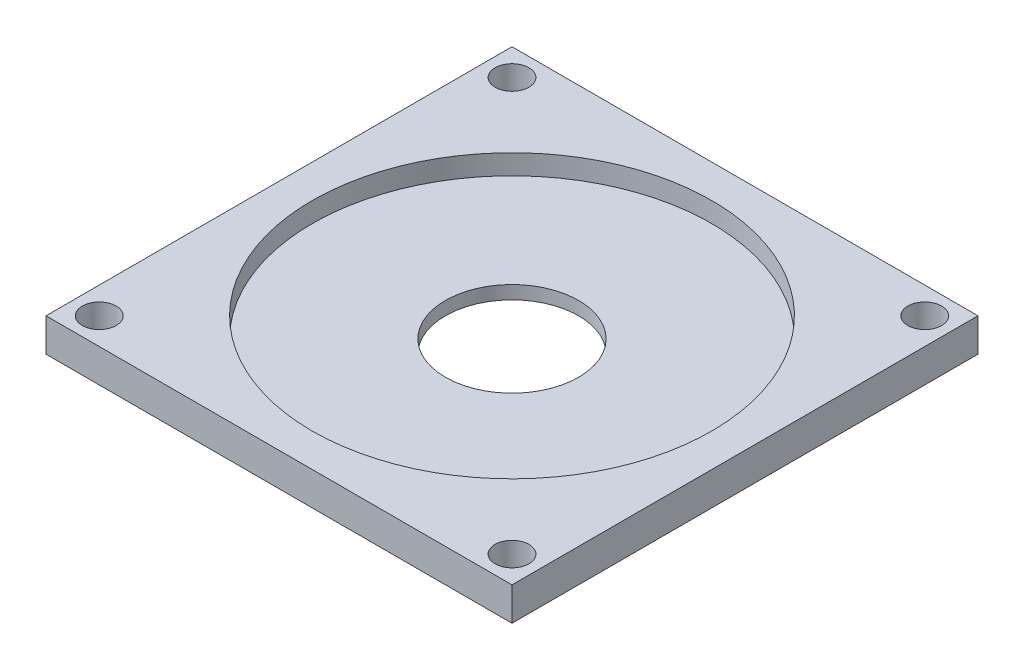
ISO-10303-21;
HEADER;
FILE_DESCRIPTION(('STEP AP214'),'2;1');
FILE_NAME('part.step','',(''),(''),'','','');
FILE_SCHEMA(('AUTOMOTIVE_DESIGN { 1 0 10303 214 1 1 1 1 }'));
ENDSEC;
DATA;
#1=APPLICATION_CONTEXT('core data for automotive mechanical design processes');
#2=APPLICATION_PROTOCOL_DEFINITION('international standard','automotive_design',2000,#1);
#3=PRODUCT_CONTEXT('',#1,'mechanical');
#4=PRODUCT('Part','Part','',(#3));
#5=PRODUCT_RELATED_PRODUCT_CATEGORY('part','',(#4));
#6=PRODUCT_DEFINITION_FORMATION('','',#4);
#7=PRODUCT_DEFINITION_CONTEXT('part definition',#1,'design');
#8=PRODUCT_DEFINITION('design','',#6,#7);
#9=PRODUCT_DEFINITION_SHAPE('','',#8);
#10=(LENGTH_UNIT() NAMED_UNIT(*) SI_UNIT(.MILLI.,.METRE.));
#11=(NAMED_UNIT(*) PLANE_ANGLE_UNIT() SI_UNIT($,.RADIAN.));
#12=(NAMED_UNIT(*) SI_UNIT($,.STERADIAN.) SOLID_ANGLE_UNIT());
#13=UNCERTAINTY_MEASURE_WITH_UNIT(LENGTH_MEASURE(1.E-05),#10,'distance_accuracy_value','');
#14=(GEOMETRIC_REPRESENTATION_CONTEXT(3) GLOBAL_UNCERTAINTY_ASSIGNED_CONTEXT((#13)) GLOBAL_UNIT_ASSIGNED_CONTEXT((#10,
#11,#12)) REPRESENTATION_CONTEXT('',''));
#15=CARTESIAN_POINT('',(0.,0.,0.));
#16=DIRECTION('',(0.,0.,1.));
#17=DIRECTION('',(1.,0.,0.));
#18=AXIS2_PLACEMENT_3D('',#15,#16,#17);
#19=CARTESIAN_POINT('',(0.,50.,0.));
#20=DIRECTION('',(1.,0.,0.));
#21=DIRECTION('',(0.,0.,-1.));
#22=AXIS2_PLACEMENT_3D('',#19,#20,#21);
#23=PLANE('',#22);
#24=DIRECTION('',(0.,0.,1.));
#25=VECTOR('',#24,1.);
#26=CARTESIAN_POINT('',(0.,0.,0.));
#27=LINE('',#26,#25);
#28=CARTESIAN_POINT('',(0.,0.,-700.));
#29=VERTEX_POINT('',#28);
#30=CARTESIAN_POINT('',(0.,0.,0.));
#31=VERTEX_POINT('',#30);
#32=EDGE_CURVE('E95',#29,#31,#27,.T.);
#33=ORIENTED_EDGE('',*,*,#32,.T.);
#34=DIRECTION('',(0.,-1.,0.));
#35=VECTOR('',#34,1.);
#36=CARTESIAN_POINT('',(0.,50.,0.));
#37=LINE('',#36,#35);
#38=CARTESIAN_POINT('',(0.,50.,0.));
#39=VERTEX_POINT('',#38);
#40=EDGE_CURVE('E11',#39,#31,#37,.T.);
#41=ORIENTED_EDGE('',*,*,#40,.F.);
#42=DIRECTION('',(0.,0.,1.));
#43=VECTOR('',#42,1.);
#44=CARTESIAN_POINT('',(0.,50.,0.));
#45=LINE('',#44,#43);
#46=CARTESIAN_POINT('',(0.,50.,-700.));
#47=VERTEX_POINT('',#46);
#48=EDGE_CURVE('E83',#47,#39,#45,.T.);
#49=ORIENTED_EDGE('',*,*,#48,.F.);
#50=DIRECTION('',(0.,-1.,0.));
#51=VECTOR('',#50,1.);
#52=CARTESIAN_POINT('',(0.,50.,-700.));
#53=LINE('',#52,#51);
#54=EDGE_CURVE('E91',#47,#29,#53,.T.);
#55=ORIENTED_EDGE('',*,*,#54,.T.);
#56=EDGE_LOOP('',(#33,#41,#49,#55));
#57=FACE_BOUND('',#56,.T.);
#58=ADVANCED_FACE('F32',(#57),#23,.F.);
#59=CARTESIAN_POINT('',(0.,50.,0.));
#60=DIRECTION('',(0.,0.,-1.));
#61=DIRECTION('',(-1.,0.,0.));
#62=AXIS2_PLACEMENT_3D('',#59,#60,#61);
#63=PLANE('',#62);
#64=DIRECTION('',(1.,0.,0.));
#65=VECTOR('',#64,1.);
#66=CARTESIAN_POINT('',(0.,0.,0.));
#67=LINE('',#66,#65);
#68=CARTESIAN_POINT('',(700.,0.,0.));
#69=VERTEX_POINT('',#68);
#70=EDGE_CURVE('E87',#31,#69,#67,.T.);
#71=ORIENTED_EDGE('',*,*,#70,.T.);
#72=DIRECTION('',(0.,-1.,0.));
#73=VECTOR('',#72,1.);
#74=CARTESIAN_POINT('',(700.,50.,0.));
#75=LINE('',#74,#73);
#76=CARTESIAN_POINT('',(700.,50.,0.));
#77=VERTEX_POINT('',#76);
#78=EDGE_CURVE('E40',#77,#69,#75,.T.);
#79=ORIENTED_EDGE('',*,*,#78,.F.);
#80=DIRECTION('',(1.,0.,0.));
#81=VECTOR('',#80,1.);
#82=CARTESIAN_POINT('',(0.,50.,0.));
#83=LINE('',#82,#81);
#84=EDGE_CURVE('E78',#39,#77,#83,.T.);
#85=ORIENTED_EDGE('',*,*,#84,.F.);
#86=ORIENTED_EDGE('',*,*,#40,.T.);
#87=EDGE_LOOP('',(#71,#79,#85,#86));
#88=FACE_BOUND('',#87,.T.);
#89=ADVANCED_FACE('F86',(#88),#63,.F.);
#90=CARTESIAN_POINT('',(700.,50.,0.));
#91=DIRECTION('',(-1.,0.,0.));
#92=DIRECTION('',(0.,0.,1.));
#93=AXIS2_PLACEMENT_3D('',#90,#91,#92);
#94=PLANE('',#93);
#95=DIRECTION('',(0.,0.,-1.));
#96=VECTOR('',#95,1.);
#97=CARTESIAN_POINT('',(700.,0.,0.));
#98=LINE('',#97,#96);
#99=CARTESIAN_POINT('',(700.,0.,-700.));
#100=VERTEX_POINT('',#99);
#101=EDGE_CURVE('E65',#69,#100,#98,.T.);
#102=ORIENTED_EDGE('',*,*,#101,.T.);
#103=DIRECTION('',(0.,-1.,0.));
#104=VECTOR('',#103,1.);
#105=CARTESIAN_POINT('',(700.,50.,-700.));
#106=LINE('',#105,#104);
#107=CARTESIAN_POINT('',(700.,50.,-700.));
#108=VERTEX_POINT('',#107);
#109=EDGE_CURVE('E88',#108,#100,#106,.T.);
#110=ORIENTED_EDGE('',*,*,#109,.F.);
#111=DIRECTION('',(0.,0.,-1.));
#112=VECTOR('',#111,1.);
#113=CARTESIAN_POINT('',(700.,50.,0.));
#114=LINE('',#113,#112);
#115=EDGE_CURVE('E81',#77,#108,#114,.T.);
#116=ORIENTED_EDGE('',*,*,#115,.F.);
#117=ORIENTED_EDGE('',*,*,#78,.T.);
#118=EDGE_LOOP('',(#102,#110,#116,#117));
#119=FACE_BOUND('',#118,.T.);
#120=ADVANCED_FACE('F89',(#119),#94,.F.);
#121=CARTESIAN_POINT('',(0.,50.,-700.));
#122=DIRECTION('',(0.,0.,1.));
#123=DIRECTION('',(1.,0.,0.));
#124=AXIS2_PLACEMENT_3D('',#121,#122,#123);
#125=PLANE('',#124);
#126=DIRECTION('',(-1.,0.,0.));
#127=VECTOR('',#126,1.);
#128=CARTESIAN_POINT('',(0.,0.,-700.));
#129=LINE('',#128,#127);
#130=EDGE_CURVE('E71',#100,#29,#129,.T.);
#131=ORIENTED_EDGE('',*,*,#130,.T.);
#132=ORIENTED_EDGE('',*,*,#54,.F.);
#133=DIRECTION('',(-1.,0.,0.));
#134=VECTOR('',#133,1.);
#135=CARTESIAN_POINT('',(0.,50.,-700.));
#136=LINE('',#135,#134);
#137=EDGE_CURVE('E48',#108,#47,#136,.T.);
#138=ORIENTED_EDGE('',*,*,#137,.F.);
#139=ORIENTED_EDGE('',*,*,#109,.T.);
#140=EDGE_LOOP('',(#131,#132,#138,#139));
#141=FACE_BOUND('',#140,.T.);
#142=ADVANCED_FACE('F103',(#141),#125,.F.);
#143=CARTESIAN_POINT('',(0.,50.,0.));
#144=DIRECTION('',(0.,-1.,0.));
#145=DIRECTION('',(0.,0.,-1.));
#146=AXIS2_PLACEMENT_3D('',#143,#144,#145);
#147=PLANE('',#146);
#148=CARTESIAN_POINT('',(350.,50.,-350.));
#149=DIRECTION('',(0.,1.,0.));
#150=DIRECTION('',(0.,0.,1.));
#151=AXIS2_PLACEMENT_3D('',#148,#149,#150);
#152=CIRCLE('',#151,300.);
#153=CARTESIAN_POINT('',(350.,50.,-50.));
#154=VERTEX_POINT('',#153);
#155=EDGE_CURVE('E133',#154,#154,#152,.T.);
#156=ORIENTED_EDGE('',*,*,#155,.F.);
#157=EDGE_LOOP('',(#156));
#158=FACE_BOUND('',#157,.T.);
#159=CARTESIAN_POINT('',(660.,50.,-40.));
#160=DIRECTION('',(0.,-1.,0.));
#161=DIRECTION('',(0.,0.,-1.));
#162=AXIS2_PLACEMENT_3D('',#159,#160,#161);
#163=CIRCLE('',#162,25.4);
#164=CARTESIAN_POINT('',(660.,50.,-65.4));
#165=VERTEX_POINT('',#164);
#166=EDGE_CURVE('E114',#165,#165,#163,.T.);
#167=ORIENTED_EDGE('',*,*,#166,.T.);
#168=EDGE_LOOP('',(#167));
#169=FACE_BOUND('',#168,.T.);
#170=CARTESIAN_POINT('',(660.,50.,-660.));
#171=DIRECTION('',(0.,-1.,0.));
#172=DIRECTION('',(0.,0.,-1.));
#173=AXIS2_PLACEMENT_3D('',#170,#171,#172);
#174=CIRCLE('',#173,25.4);
#175=CARTESIAN_POINT('',(660.,50.,-685.4));
#176=VERTEX_POINT('',#175);
#177=EDGE_CURVE('E117',#176,#176,#174,.T.);
#178=ORIENTED_EDGE('',*,*,#177,.T.);
#179=EDGE_LOOP('',(#178));
#180=FACE_BOUND('',#179,.T.);
#181=CARTESIAN_POINT('',(40.,50.,-660.));
#182=DIRECTION('',(0.,-1.,0.));
#183=DIRECTION('',(0.,0.,-1.));
#184=AXIS2_PLACEMENT_3D('',#181,#182,#183);
#185=CIRCLE('',#184,25.4);
#186=CARTESIAN_POINT('',(40.,50.,-685.4));
#187=VERTEX_POINT('',#186);
#188=EDGE_CURVE('E120',#187,#187,#185,.T.);
#189=ORIENTED_EDGE('',*,*,#188,.T.);
#190=EDGE_LOOP('',(#189));
#191=FACE_BOUND('',#190,.T.);
#192=CARTESIAN_POINT('',(40.,50.,-40.));
#193=DIRECTION('',(0.,-1.,0.));
#194=DIRECTION('',(0.,0.,-1.));
#195=AXIS2_PLACEMENT_3D('',#192,#193,#194);
#196=CIRCLE('',#195,25.4);
#197=CARTESIAN_POINT('',(40.,50.,-65.4));
#198=VERTEX_POINT('',#197);
#199=EDGE_CURVE('E98',#198,#198,#196,.T.);
#200=ORIENTED_EDGE('',*,*,#199,.T.);
#201=EDGE_LOOP('',(#200));
#202=FACE_BOUND('',#201,.T.);
#203=ORIENTED_EDGE('',*,*,#48,.T.);
#204=ORIENTED_EDGE('',*,*,#84,.T.);
#205=ORIENTED_EDGE('',*,*,#115,.T.);
#206=ORIENTED_EDGE('',*,*,#137,.T.);
#207=EDGE_LOOP('',(#203,#204,#205,#206));
#208=FACE_BOUND('',#207,.T.);
#209=ADVANCED_FACE('F79',(#158,#169,#180,#191,#202,#208),#147,.F.);
#210=CARTESIAN_POINT('',(0.,0.,0.));
#211=DIRECTION('',(0.,-1.,0.));
#212=DIRECTION('',(0.,0.,-1.));
#213=AXIS2_PLACEMENT_3D('',#210,#211,#212);
#214=PLANE('',#213);
#215=CARTESIAN_POINT('',(350.,0.,-350.));
#216=DIRECTION('',(0.,1.,0.));
#217=DIRECTION('',(0.,0.,1.));
#218=AXIS2_PLACEMENT_3D('',#215,#216,#217);
#219=CIRCLE('',#218,100.);
#220=CARTESIAN_POINT('',(350.,0.,-250.));
#221=VERTEX_POINT('',#220);
#222=EDGE_CURVE('E136',#221,#221,#219,.T.);
#223=ORIENTED_EDGE('',*,*,#222,.T.);
#224=EDGE_LOOP('',(#223));
#225=FACE_BOUND('',#224,.T.);
#226=CARTESIAN_POINT('',(660.,0.,-40.));
#227=DIRECTION('',(0.,1.,0.));
#228=DIRECTION('',(0.,0.,1.));
#229=AXIS2_PLACEMENT_3D('',#226,#227,#228);
#230=CIRCLE('',#229,25.4);
#231=CARTESIAN_POINT('',(660.,0.,-14.6));
#232=VERTEX_POINT('',#231);
#233=EDGE_CURVE('E123',#232,#232,#230,.T.);
#234=ORIENTED_EDGE('',*,*,#233,.T.);
#235=EDGE_LOOP('',(#234));
#236=FACE_BOUND('',#235,.T.);
#237=CARTESIAN_POINT('',(660.,0.,-660.));
#238=DIRECTION('',(0.,1.,0.));
#239=DIRECTION('',(0.,0.,1.));
#240=AXIS2_PLACEMENT_3D('',#237,#238,#239);
#241=CIRCLE('',#240,25.4);
#242=CARTESIAN_POINT('',(660.,0.,-634.6));
#243=VERTEX_POINT('',#242);
#244=EDGE_CURVE('E127',#243,#243,#241,.T.);
#245=ORIENTED_EDGE('',*,*,#244,.T.);
#246=EDGE_LOOP('',(#245));
#247=FACE_BOUND('',#246,.T.);
#248=CARTESIAN_POINT('',(40.,0.,-660.));
#249=DIRECTION('',(0.,1.,0.));
#250=DIRECTION('',(0.,0.,1.));
#251=AXIS2_PLACEMENT_3D('',#248,#249,#250);
#252=CIRCLE('',#251,25.4);
#253=CARTESIAN_POINT('',(40.,0.,-634.6));
#254=VERTEX_POINT('',#253);
#255=EDGE_CURVE('E124',#254,#254,#252,.T.);
#256=ORIENTED_EDGE('',*,*,#255,.T.);
#257=EDGE_LOOP('',(#256));
#258=FACE_BOUND('',#257,.T.);
#259=CARTESIAN_POINT('',(40.,0.,-40.));
#260=DIRECTION('',(0.,1.,0.));
#261=DIRECTION('',(0.,0.,1.));
#262=AXIS2_PLACEMENT_3D('',#259,#260,#261);
#263=CIRCLE('',#262,25.4);
#264=CARTESIAN_POINT('',(40.,0.,-14.6));
#265=VERTEX_POINT('',#264);
#266=EDGE_CURVE('E111',#265,#265,#263,.T.);
#267=ORIENTED_EDGE('',*,*,#266,.T.);
#268=EDGE_LOOP('',(#267));
#269=FACE_BOUND('',#268,.T.);
#270=ORIENTED_EDGE('',*,*,#32,.F.);
#271=ORIENTED_EDGE('',*,*,#130,.F.);
#272=ORIENTED_EDGE('',*,*,#101,.F.);
#273=ORIENTED_EDGE('',*,*,#70,.F.);
#274=EDGE_LOOP('',(#270,#271,#272,#273));
#275=FACE_BOUND('',#274,.T.);
#276=ADVANCED_FACE('F106',(#225,#236,#247,#258,#269,#275),#214,.T.);
#277=CARTESIAN_POINT('',(40.,0.,-40.));
#278=DIRECTION('',(0.,1.,0.));
#279=DIRECTION('',(0.,0.,1.));
#280=AXIS2_PLACEMENT_3D('',#277,#278,#279);
#281=CYLINDRICAL_SURFACE('',#280,25.4);
#282=ORIENTED_EDGE('',*,*,#266,.F.);
#283=EDGE_LOOP('',(#282));
#284=FACE_BOUND('',#283,.T.);
#285=ORIENTED_EDGE('',*,*,#199,.F.);
#286=EDGE_LOOP('',(#285));
#287=FACE_BOUND('',#286,.T.);
#288=ADVANCED_FACE('F177',(#284,#287),#281,.F.);
#289=CARTESIAN_POINT('',(40.,0.,-660.));
#290=DIRECTION('',(0.,1.,0.));
#291=DIRECTION('',(0.,0.,1.));
#292=AXIS2_PLACEMENT_3D('',#289,#290,#291);
#293=CYLINDRICAL_SURFACE('',#292,25.4);
#294=ORIENTED_EDGE('',*,*,#255,.F.);
#295=EDGE_LOOP('',(#294));
#296=FACE_BOUND('',#295,.T.);
#297=ORIENTED_EDGE('',*,*,#188,.F.);
#298=EDGE_LOOP('',(#297));
#299=FACE_BOUND('',#298,.T.);
#300=ADVANCED_FACE('F179',(#296,#299),#293,.F.);
#301=CARTESIAN_POINT('',(660.,0.,-660.));
#302=DIRECTION('',(0.,1.,0.));
#303=DIRECTION('',(0.,0.,1.));
#304=AXIS2_PLACEMENT_3D('',#301,#302,#303);
#305=CYLINDRICAL_SURFACE('',#304,25.4);
#306=ORIENTED_EDGE('',*,*,#244,.F.);
#307=EDGE_LOOP('',(#306));
#308=FACE_BOUND('',#307,.T.);
#309=ORIENTED_EDGE('',*,*,#177,.F.);
#310=EDGE_LOOP('',(#309));
#311=FACE_BOUND('',#310,.T.);
#312=ADVANCED_FACE('F186',(#308,#311),#305,.F.);
#313=CARTESIAN_POINT('',(660.,0.,-40.));
#314=DIRECTION('',(0.,1.,0.));
#315=DIRECTION('',(0.,0.,1.));
#316=AXIS2_PLACEMENT_3D('',#313,#314,#315);
#317=CYLINDRICAL_SURFACE('',#316,25.4);
#318=ORIENTED_EDGE('',*,*,#233,.F.);
#319=EDGE_LOOP('',(#318));
#320=FACE_BOUND('',#319,.T.);
#321=ORIENTED_EDGE('',*,*,#166,.F.);
#322=EDGE_LOOP('',(#321));
#323=FACE_BOUND('',#322,.T.);
#324=ADVANCED_FACE('F162',(#320,#323),#317,.F.);
#325=CARTESIAN_POINT('',(350.,20.,-350.));
#326=DIRECTION('',(0.,1.,0.));
#327=DIRECTION('',(0.,0.,1.));
#328=AXIS2_PLACEMENT_3D('',#325,#326,#327);
#329=CYLINDRICAL_SURFACE('',#328,300.);
#330=CARTESIAN_POINT('',(350.,20.,-350.));
#331=DIRECTION('',(0.,1.,0.));
#332=DIRECTION('',(0.,0.,1.));
#333=AXIS2_PLACEMENT_3D('',#330,#331,#332);
#334=CIRCLE('',#333,300.);
#335=CARTESIAN_POINT('',(350.,20.,-50.));
#336=VERTEX_POINT('',#335);
#337=EDGE_CURVE('E128',#336,#336,#334,.T.);
#338=ORIENTED_EDGE('',*,*,#337,.F.);
#339=EDGE_LOOP('',(#338));
#340=FACE_BOUND('',#339,.T.);
#341=ORIENTED_EDGE('',*,*,#155,.T.);
#342=EDGE_LOOP('',(#341));
#343=FACE_BOUND('',#342,.T.);
#344=ADVANCED_FACE('F156',(#340,#343),#329,.F.);
#345=CARTESIAN_POINT('',(350.,20.,-350.));
#346=DIRECTION('',(0.,1.,0.));
#347=DIRECTION('',(0.,0.,1.));
#348=AXIS2_PLACEMENT_3D('',#345,#346,#347);
#349=PLANE('',#348);
#350=CARTESIAN_POINT('',(350.,20.,-350.));
#351=DIRECTION('',(0.,1.,0.));
#352=DIRECTION('',(0.,0.,1.));
#353=AXIS2_PLACEMENT_3D('',#350,#351,#352);
#354=CIRCLE('',#353,100.);
#355=CARTESIAN_POINT('',(350.,20.,-250.));
#356=VERTEX_POINT('',#355);
#357=EDGE_CURVE('E139',#356,#356,#354,.T.);
#358=ORIENTED_EDGE('',*,*,#357,.F.);
#359=EDGE_LOOP('',(#358));
#360=FACE_BOUND('',#359,.T.);
#361=ORIENTED_EDGE('',*,*,#337,.T.);
#362=EDGE_LOOP('',(#361));
#363=FACE_BOUND('',#362,.T.);
#364=ADVANCED_FACE('F150',(#360,#363),#349,.T.);
#365=CARTESIAN_POINT('',(350.,0.,-350.));
#366=DIRECTION('',(0.,1.,0.));
#367=DIRECTION('',(0.,0.,1.));
#368=AXIS2_PLACEMENT_3D('',#365,#366,#367);
#369=CYLINDRICAL_SURFACE('',#368,100.);
#370=ORIENTED_EDGE('',*,*,#222,.F.);
#371=EDGE_LOOP('',(#370));
#372=FACE_BOUND('',#371,.T.);
#373=ORIENTED_EDGE('',*,*,#357,.T.);
#374=EDGE_LOOP('',(#373));
#375=FACE_BOUND('',#374,.T.);
#376=ADVANCED_FACE('F147',(#372,#375),#369,.F.);
#377=CLOSED_SHELL('',(#58,#89,#120,#142,#209,#276,#288,#300,#312,#324,#344,#364,#376));
#378=MANIFOLD_SOLID_BREP('B2',#377);
#379=ADVANCED_BREP_SHAPE_REPRESENTATION('',(#18,#378),#14);
#380=SHAPE_DEFINITION_REPRESENTATION(#9,#379);
ENDSEC;
END-ISO-10303-21;
